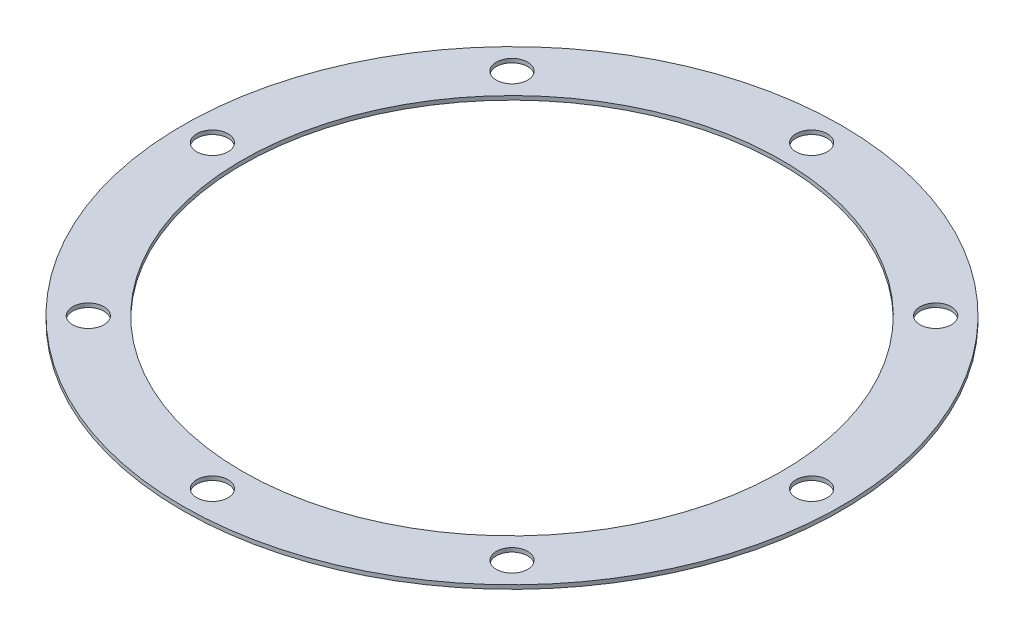
ISO-10303-21;
HEADER;
FILE_DESCRIPTION(('STEP AP214'),'2;1');
FILE_NAME('part.step','',(''),(''),'','','');
FILE_SCHEMA(('AUTOMOTIVE_DESIGN { 1 0 10303 214 1 1 1 1 }'));
ENDSEC;
DATA;
#1=APPLICATION_CONTEXT('core data for automotive mechanical design processes');
#2=APPLICATION_PROTOCOL_DEFINITION('international standard','automotive_design',2000,#1);
#3=PRODUCT_CONTEXT('',#1,'mechanical');
#4=PRODUCT('Part','Part','',(#3));
#5=PRODUCT_RELATED_PRODUCT_CATEGORY('part','',(#4));
#6=PRODUCT_DEFINITION_FORMATION('','',#4);
#7=PRODUCT_DEFINITION_CONTEXT('part definition',#1,'design');
#8=PRODUCT_DEFINITION('design','',#6,#7);
#9=PRODUCT_DEFINITION_SHAPE('','',#8);
#10=(LENGTH_UNIT() NAMED_UNIT(*) SI_UNIT(.MILLI.,.METRE.));
#11=(NAMED_UNIT(*) PLANE_ANGLE_UNIT() SI_UNIT($,.RADIAN.));
#12=(NAMED_UNIT(*) SI_UNIT($,.STERADIAN.) SOLID_ANGLE_UNIT());
#13=UNCERTAINTY_MEASURE_WITH_UNIT(LENGTH_MEASURE(1.E-05),#10,'distance_accuracy_value','');
#14=(GEOMETRIC_REPRESENTATION_CONTEXT(3) GLOBAL_UNCERTAINTY_ASSIGNED_CONTEXT((#13)) GLOBAL_UNIT_ASSIGNED_CONTEXT((#10,
#11,#12)) REPRESENTATION_CONTEXT('',''));
#15=CARTESIAN_POINT('',(0.,0.,0.));
#16=DIRECTION('',(0.,0.,1.));
#17=DIRECTION('',(1.,0.,0.));
#18=AXIS2_PLACEMENT_3D('',#15,#16,#17);
#19=CARTESIAN_POINT('',(0.,0.8382,0.));
#20=DIRECTION('',(0.,1.,0.));
#21=DIRECTION('',(0.,0.,1.));
#22=AXIS2_PLACEMENT_3D('',#19,#20,#21);
#23=PLANE('',#22);
#24=CARTESIAN_POINT('',(-63.5,0.8382,2.21709065016539E-13));
#25=DIRECTION('',(0.,1.,0.));
#26=DIRECTION('',(1.,0.,0.));
#27=AXIS2_PLACEMENT_3D('',#24,#25,#26);
#28=CIRCLE('',#27,3.3147);
#29=CARTESIAN_POINT('',(-60.1853,0.8382,2.10135851822676E-13));
#30=VERTEX_POINT('',#29);
#31=EDGE_CURVE('E133',#30,#30,#28,.T.);
#32=ORIENTED_EDGE('',*,*,#31,.F.);
#33=EDGE_LOOP('',(#32));
#34=FACE_BOUND('',#33,.T.);
#35=CARTESIAN_POINT('',(-44.9012806053455,0.8382,44.901280605346));
#36=DIRECTION('',(0.,1.,0.));
#37=DIRECTION('',(0.707106781186544,0.,-0.707106781186551));
#38=AXIS2_PLACEMENT_3D('',#35,#36,#37);
#39=CIRCLE('',#38,3.3147);
#40=CARTESIAN_POINT('',(-42.5574337577465,0.8382,42.5574337577469));
#41=VERTEX_POINT('',#40);
#42=EDGE_CURVE('E137',#41,#41,#39,.T.);
#43=ORIENTED_EDGE('',*,*,#42,.F.);
#44=EDGE_LOOP('',(#43));
#45=FACE_BOUND('',#44,.T.);
#46=CARTESIAN_POINT('',(0.,0.8382,63.5));
#47=DIRECTION('',(0.,1.,0.));
#48=DIRECTION('',(0.,0.,-1.));
#49=AXIS2_PLACEMENT_3D('',#46,#47,#48);
#50=CIRCLE('',#49,3.3147);
#51=CARTESIAN_POINT('',(0.,0.8382,60.1853));
#52=VERTEX_POINT('',#51);
#53=EDGE_CURVE('E141',#52,#52,#50,.T.);
#54=ORIENTED_EDGE('',*,*,#53,.F.);
#55=EDGE_LOOP('',(#54));
#56=FACE_BOUND('',#55,.T.);
#57=CARTESIAN_POINT('',(44.9012806053462,0.8382,44.9012806053454));
#58=DIRECTION('',(0.,1.,0.));
#59=DIRECTION('',(-0.707106781186554,0.,-0.707106781186541));
#60=AXIS2_PLACEMENT_3D('',#57,#58,#59);
#61=CIRCLE('',#60,3.3147);
#62=CARTESIAN_POINT('',(42.5574337577471,0.8382,42.5574337577464));
#63=VERTEX_POINT('',#62);
#64=EDGE_CURVE('E145',#63,#63,#61,.T.);
#65=ORIENTED_EDGE('',*,*,#64,.F.);
#66=EDGE_LOOP('',(#65));
#67=FACE_BOUND('',#66,.T.);
#68=CARTESIAN_POINT('',(63.5,0.8382,-6.65127195049617E-13));
#69=DIRECTION('',(0.,1.,0.));
#70=DIRECTION('',(-1.,0.,0.));
#71=AXIS2_PLACEMENT_3D('',#68,#69,#70);
#72=CIRCLE('',#71,3.3147);
#73=CARTESIAN_POINT('',(60.1853,0.8382,-6.30407555468027E-13));
#74=VERTEX_POINT('',#73);
#75=EDGE_CURVE('E149',#74,#74,#72,.T.);
#76=ORIENTED_EDGE('',*,*,#75,.F.);
#77=EDGE_LOOP('',(#76));
#78=FACE_BOUND('',#77,.T.);
#79=CARTESIAN_POINT('',(44.9012806053452,0.8382,-44.9012806053463));
#80=DIRECTION('',(0.,1.,0.));
#81=DIRECTION('',(-0.707106781186539,0.,0.707106781186556));
#82=AXIS2_PLACEMENT_3D('',#79,#80,#81);
#83=CIRCLE('',#82,3.3147);
#84=CARTESIAN_POINT('',(42.5574337577462,0.8382,-42.5574337577472));
#85=VERTEX_POINT('',#84);
#86=EDGE_CURVE('E153',#85,#85,#83,.T.);
#87=ORIENTED_EDGE('',*,*,#86,.F.);
#88=EDGE_LOOP('',(#87));
#89=FACE_BOUND('',#88,.T.);
#90=CARTESIAN_POINT('',(-44.9012806053459,0.8382,-44.9012806053457));
#91=DIRECTION('',(0.,1.,0.));
#92=DIRECTION('',(0.707106781186549,0.,0.707106781186546));
#93=AXIS2_PLACEMENT_3D('',#90,#91,#92);
#94=CIRCLE('',#93,3.3147);
#95=CARTESIAN_POINT('',(-42.5574337577468,0.8382,-42.5574337577467));
#96=VERTEX_POINT('',#95);
#97=EDGE_CURVE('E71',#96,#96,#94,.T.);
#98=ORIENTED_EDGE('',*,*,#97,.F.);
#99=EDGE_LOOP('',(#98));
#100=FACE_BOUND('',#99,.T.);
#101=CARTESIAN_POINT('',(0.,0.8382,-63.5));
#102=DIRECTION('',(0.,1.,0.));
#103=DIRECTION('',(0.,0.,1.));
#104=AXIS2_PLACEMENT_3D('',#101,#102,#103);
#105=CIRCLE('',#104,3.3147);
#106=CARTESIAN_POINT('',(0.,0.8382,-60.1853));
#107=VERTEX_POINT('',#106);
#108=EDGE_CURVE('E65',#107,#107,#105,.T.);
#109=ORIENTED_EDGE('',*,*,#108,.F.);
#110=EDGE_LOOP('',(#109));
#111=FACE_BOUND('',#110,.T.);
#112=CARTESIAN_POINT('',(0.,0.8382,0.));
#113=DIRECTION('',(0.,1.,0.));
#114=DIRECTION('',(0.,0.,1.));
#115=AXIS2_PLACEMENT_3D('',#112,#113,#114);
#116=CIRCLE('',#115,69.85);
#117=CARTESIAN_POINT('',(0.,0.8382,69.85));
#118=VERTEX_POINT('',#117);
#119=EDGE_CURVE('E10',#118,#118,#116,.T.);
#120=ORIENTED_EDGE('',*,*,#119,.T.);
#121=EDGE_LOOP('',(#120));
#122=FACE_BOUND('',#121,.T.);
#123=CARTESIAN_POINT('',(0.,0.8382,0.));
#124=DIRECTION('',(0.,1.,0.));
#125=DIRECTION('',(0.,0.,1.));
#126=AXIS2_PLACEMENT_3D('',#123,#124,#125);
#127=CIRCLE('',#126,57.15);
#128=CARTESIAN_POINT('',(0.,0.8382,57.15));
#129=VERTEX_POINT('',#128);
#130=EDGE_CURVE('E55',#129,#129,#127,.T.);
#131=ORIENTED_EDGE('',*,*,#130,.F.);
#132=EDGE_LOOP('',(#131));
#133=FACE_BOUND('',#132,.T.);
#134=ADVANCED_FACE('F40',(#34,#45,#56,#67,#78,#89,#100,#111,#122,#133),#23,.T.);
#135=CARTESIAN_POINT('',(0.,0.,0.));
#136=DIRECTION('',(0.,1.,0.));
#137=DIRECTION('',(0.,0.,1.));
#138=AXIS2_PLACEMENT_3D('',#135,#136,#137);
#139=PLANE('',#138);
#140=CARTESIAN_POINT('',(-63.5,0.,2.21709065016539E-13));
#141=DIRECTION('',(0.,1.,0.));
#142=DIRECTION('',(0.,0.,1.));
#143=AXIS2_PLACEMENT_3D('',#140,#141,#142);
#144=CIRCLE('',#143,3.3147);
#145=CARTESIAN_POINT('',(-63.5,0.,3.31470000000022));
#146=VERTEX_POINT('',#145);
#147=EDGE_CURVE('E44',#146,#146,#144,.T.);
#148=ORIENTED_EDGE('',*,*,#147,.T.);
#149=EDGE_LOOP('',(#148));
#150=FACE_BOUND('',#149,.T.);
#151=CARTESIAN_POINT('',(-44.9012806053455,0.,44.901280605346));
#152=DIRECTION('',(0.,1.,0.));
#153=DIRECTION('',(0.,0.,1.));
#154=AXIS2_PLACEMENT_3D('',#151,#152,#153);
#155=CIRCLE('',#154,3.3147);
#156=CARTESIAN_POINT('',(-44.9012806053455,0.,48.215980605346));
#157=VERTEX_POINT('',#156);
#158=EDGE_CURVE('E86',#157,#157,#155,.T.);
#159=ORIENTED_EDGE('',*,*,#158,.T.);
#160=EDGE_LOOP('',(#159));
#161=FACE_BOUND('',#160,.T.);
#162=CARTESIAN_POINT('',(0.,0.,63.5));
#163=DIRECTION('',(0.,1.,0.));
#164=DIRECTION('',(0.,0.,1.));
#165=AXIS2_PLACEMENT_3D('',#162,#163,#164);
#166=CIRCLE('',#165,3.3147);
#167=CARTESIAN_POINT('',(0.,0.,66.8147));
#168=VERTEX_POINT('',#167);
#169=EDGE_CURVE('E83',#168,#168,#166,.T.);
#170=ORIENTED_EDGE('',*,*,#169,.T.);
#171=EDGE_LOOP('',(#170));
#172=FACE_BOUND('',#171,.T.);
#173=CARTESIAN_POINT('',(44.9012806053462,0.,44.9012806053454));
#174=DIRECTION('',(0.,1.,0.));
#175=DIRECTION('',(0.,0.,1.));
#176=AXIS2_PLACEMENT_3D('',#173,#174,#175);
#177=CIRCLE('',#176,3.3147);
#178=CARTESIAN_POINT('',(44.9012806053462,0.,48.2159806053454));
#179=VERTEX_POINT('',#178);
#180=EDGE_CURVE('E79',#179,#179,#177,.T.);
#181=ORIENTED_EDGE('',*,*,#180,.T.);
#182=EDGE_LOOP('',(#181));
#183=FACE_BOUND('',#182,.T.);
#184=CARTESIAN_POINT('',(63.5,0.,-6.65127195049617E-13));
#185=DIRECTION('',(0.,1.,0.));
#186=DIRECTION('',(0.,0.,1.));
#187=AXIS2_PLACEMENT_3D('',#184,#185,#186);
#188=CIRCLE('',#187,3.3147);
#189=CARTESIAN_POINT('',(63.5,0.,3.31469999999933));
#190=VERTEX_POINT('',#189);
#191=EDGE_CURVE('E75',#190,#190,#188,.T.);
#192=ORIENTED_EDGE('',*,*,#191,.T.);
#193=EDGE_LOOP('',(#192));
#194=FACE_BOUND('',#193,.T.);
#195=CARTESIAN_POINT('',(44.9012806053452,0.,-44.9012806053463));
#196=DIRECTION('',(0.,1.,0.));
#197=DIRECTION('',(0.,0.,1.));
#198=AXIS2_PLACEMENT_3D('',#195,#196,#197);
#199=CIRCLE('',#198,3.3147);
#200=CARTESIAN_POINT('',(44.9012806053452,0.,-41.5865806053463));
#201=VERTEX_POINT('',#200);
#202=EDGE_CURVE('E70',#201,#201,#199,.T.);
#203=ORIENTED_EDGE('',*,*,#202,.T.);
#204=EDGE_LOOP('',(#203));
#205=FACE_BOUND('',#204,.T.);
#206=CARTESIAN_POINT('',(-44.9012806053459,0.,-44.9012806053457));
#207=DIRECTION('',(0.,1.,0.));
#208=DIRECTION('',(0.,0.,1.));
#209=AXIS2_PLACEMENT_3D('',#206,#207,#208);
#210=CIRCLE('',#209,3.3147);
#211=CARTESIAN_POINT('',(-44.9012806053459,0.,-41.5865806053457));
#212=VERTEX_POINT('',#211);
#213=EDGE_CURVE('E66',#212,#212,#210,.T.);
#214=ORIENTED_EDGE('',*,*,#213,.T.);
#215=EDGE_LOOP('',(#214));
#216=FACE_BOUND('',#215,.T.);
#217=CARTESIAN_POINT('',(0.,0.,-63.5));
#218=DIRECTION('',(0.,1.,0.));
#219=DIRECTION('',(0.,0.,1.));
#220=AXIS2_PLACEMENT_3D('',#217,#218,#219);
#221=CIRCLE('',#220,3.3147);
#222=CARTESIAN_POINT('',(0.,0.,-60.1853));
#223=VERTEX_POINT('',#222);
#224=EDGE_CURVE('E61',#223,#223,#221,.T.);
#225=ORIENTED_EDGE('',*,*,#224,.T.);
#226=EDGE_LOOP('',(#225));
#227=FACE_BOUND('',#226,.T.);
#228=CARTESIAN_POINT('',(0.,0.,0.));
#229=DIRECTION('',(0.,1.,0.));
#230=DIRECTION('',(0.,0.,1.));
#231=AXIS2_PLACEMENT_3D('',#228,#229,#230);
#232=CIRCLE('',#231,69.85);
#233=CARTESIAN_POINT('',(0.,0.,69.85));
#234=VERTEX_POINT('',#233);
#235=EDGE_CURVE('E49',#234,#234,#232,.T.);
#236=ORIENTED_EDGE('',*,*,#235,.F.);
#237=EDGE_LOOP('',(#236));
#238=FACE_BOUND('',#237,.T.);
#239=CARTESIAN_POINT('',(0.,0.,0.));
#240=DIRECTION('',(0.,1.,0.));
#241=DIRECTION('',(0.,0.,1.));
#242=AXIS2_PLACEMENT_3D('',#239,#240,#241);
#243=CIRCLE('',#242,57.15);
#244=CARTESIAN_POINT('',(0.,0.,57.15));
#245=VERTEX_POINT('',#244);
#246=EDGE_CURVE('E58',#245,#245,#243,.T.);
#247=ORIENTED_EDGE('',*,*,#246,.T.);
#248=EDGE_LOOP('',(#247));
#249=FACE_BOUND('',#248,.T.);
#250=ADVANCED_FACE('F110',(#150,#161,#172,#183,#194,#205,#216,#227,#238,#249),#139,.F.);
#251=CARTESIAN_POINT('',(0.,0.8382,0.));
#252=DIRECTION('',(0.,-1.,0.));
#253=DIRECTION('',(0.,0.,-1.));
#254=AXIS2_PLACEMENT_3D('',#251,#252,#253);
#255=CYLINDRICAL_SURFACE('',#254,69.85);
#256=ORIENTED_EDGE('',*,*,#119,.F.);
#257=EDGE_LOOP('',(#256));
#258=FACE_BOUND('',#257,.T.);
#259=ORIENTED_EDGE('',*,*,#235,.T.);
#260=EDGE_LOOP('',(#259));
#261=FACE_BOUND('',#260,.T.);
#262=ADVANCED_FACE('F42',(#258,#261),#255,.T.);
#263=CARTESIAN_POINT('',(0.,0.8382,0.));
#264=DIRECTION('',(0.,-1.,0.));
#265=DIRECTION('',(0.,0.,-1.));
#266=AXIS2_PLACEMENT_3D('',#263,#264,#265);
#267=CYLINDRICAL_SURFACE('',#266,57.15);
#268=ORIENTED_EDGE('',*,*,#130,.T.);
#269=EDGE_LOOP('',(#268));
#270=FACE_BOUND('',#269,.T.);
#271=ORIENTED_EDGE('',*,*,#246,.F.);
#272=EDGE_LOOP('',(#271));
#273=FACE_BOUND('',#272,.T.);
#274=ADVANCED_FACE('F112',(#270,#273),#267,.F.);
#275=CARTESIAN_POINT('',(0.,-1.7018,-63.5));
#276=DIRECTION('',(0.,1.,0.));
#277=DIRECTION('',(0.,0.,1.));
#278=AXIS2_PLACEMENT_3D('',#275,#276,#277);
#279=CYLINDRICAL_SURFACE('',#278,3.3147);
#280=ORIENTED_EDGE('',*,*,#108,.T.);
#281=EDGE_LOOP('',(#280));
#282=FACE_BOUND('',#281,.T.);
#283=ORIENTED_EDGE('',*,*,#224,.F.);
#284=EDGE_LOOP('',(#283));
#285=FACE_BOUND('',#284,.T.);
#286=ADVANCED_FACE('F114',(#282,#285),#279,.F.);
#287=CARTESIAN_POINT('',(-44.9012806053459,-1.7018,-44.9012806053457));
#288=DIRECTION('',(0.,1.,0.));
#289=DIRECTION('',(0.,0.,1.));
#290=AXIS2_PLACEMENT_3D('',#287,#288,#289);
#291=CYLINDRICAL_SURFACE('',#290,3.3147);
#292=ORIENTED_EDGE('',*,*,#97,.T.);
#293=EDGE_LOOP('',(#292));
#294=FACE_BOUND('',#293,.T.);
#295=ORIENTED_EDGE('',*,*,#213,.F.);
#296=EDGE_LOOP('',(#295));
#297=FACE_BOUND('',#296,.T.);
#298=ADVANCED_FACE('F120',(#294,#297),#291,.F.);
#299=CARTESIAN_POINT('',(44.9012806053452,-1.7018,-44.9012806053463));
#300=DIRECTION('',(0.,1.,0.));
#301=DIRECTION('',(0.,0.,1.));
#302=AXIS2_PLACEMENT_3D('',#299,#300,#301);
#303=CYLINDRICAL_SURFACE('',#302,3.3147);
#304=ORIENTED_EDGE('',*,*,#86,.T.);
#305=EDGE_LOOP('',(#304));
#306=FACE_BOUND('',#305,.T.);
#307=ORIENTED_EDGE('',*,*,#202,.F.);
#308=EDGE_LOOP('',(#307));
#309=FACE_BOUND('',#308,.T.);
#310=ADVANCED_FACE('F175',(#306,#309),#303,.F.);
#311=CARTESIAN_POINT('',(63.5,-1.7018,-6.65127195049617E-13));
#312=DIRECTION('',(0.,1.,0.));
#313=DIRECTION('',(0.,0.,1.));
#314=AXIS2_PLACEMENT_3D('',#311,#312,#313);
#315=CYLINDRICAL_SURFACE('',#314,3.3147);
#316=ORIENTED_EDGE('',*,*,#75,.T.);
#317=EDGE_LOOP('',(#316));
#318=FACE_BOUND('',#317,.T.);
#319=ORIENTED_EDGE('',*,*,#191,.F.);
#320=EDGE_LOOP('',(#319));
#321=FACE_BOUND('',#320,.T.);
#322=ADVANCED_FACE('F178',(#318,#321),#315,.F.);
#323=CARTESIAN_POINT('',(44.9012806053462,-1.7018,44.9012806053454));
#324=DIRECTION('',(0.,1.,0.));
#325=DIRECTION('',(0.,0.,1.));
#326=AXIS2_PLACEMENT_3D('',#323,#324,#325);
#327=CYLINDRICAL_SURFACE('',#326,3.3147);
#328=ORIENTED_EDGE('',*,*,#64,.T.);
#329=EDGE_LOOP('',(#328));
#330=FACE_BOUND('',#329,.T.);
#331=ORIENTED_EDGE('',*,*,#180,.F.);
#332=EDGE_LOOP('',(#331));
#333=FACE_BOUND('',#332,.T.);
#334=ADVANCED_FACE('F196',(#330,#333),#327,.F.);
#335=CARTESIAN_POINT('',(0.,-1.7018,63.5));
#336=DIRECTION('',(0.,1.,0.));
#337=DIRECTION('',(0.,0.,1.));
#338=AXIS2_PLACEMENT_3D('',#335,#336,#337);
#339=CYLINDRICAL_SURFACE('',#338,3.3147);
#340=ORIENTED_EDGE('',*,*,#53,.T.);
#341=EDGE_LOOP('',(#340));
#342=FACE_BOUND('',#341,.T.);
#343=ORIENTED_EDGE('',*,*,#169,.F.);
#344=EDGE_LOOP('',(#343));
#345=FACE_BOUND('',#344,.T.);
#346=ADVANCED_FACE('F199',(#342,#345),#339,.F.);
#347=CARTESIAN_POINT('',(-44.9012806053455,-1.7018,44.901280605346));
#348=DIRECTION('',(0.,1.,0.));
#349=DIRECTION('',(0.,0.,1.));
#350=AXIS2_PLACEMENT_3D('',#347,#348,#349);
#351=CYLINDRICAL_SURFACE('',#350,3.3147);
#352=ORIENTED_EDGE('',*,*,#42,.T.);
#353=EDGE_LOOP('',(#352));
#354=FACE_BOUND('',#353,.T.);
#355=ORIENTED_EDGE('',*,*,#158,.F.);
#356=EDGE_LOOP('',(#355));
#357=FACE_BOUND('',#356,.T.);
#358=ADVANCED_FACE('F202',(#354,#357),#351,.F.);
#359=CARTESIAN_POINT('',(-63.5,-1.7018,2.21709065016539E-13));
#360=DIRECTION('',(0.,1.,0.));
#361=DIRECTION('',(0.,0.,1.));
#362=AXIS2_PLACEMENT_3D('',#359,#360,#361);
#363=CYLINDRICAL_SURFACE('',#362,3.3147);
#364=ORIENTED_EDGE('',*,*,#31,.T.);
#365=EDGE_LOOP('',(#364));
#366=FACE_BOUND('',#365,.T.);
#367=ORIENTED_EDGE('',*,*,#147,.F.);
#368=EDGE_LOOP('',(#367));
#369=FACE_BOUND('',#368,.T.);
#370=ADVANCED_FACE('F206',(#366,#369),#363,.F.);
#371=CLOSED_SHELL('',(#134,#250,#262,#274,#286,#298,#310,#322,#334,#346,#358,#370));
#372=MANIFOLD_SOLID_BREP('B2',#371);
#373=ADVANCED_BREP_SHAPE_REPRESENTATION('',(#18,#372),#14);
#374=SHAPE_DEFINITION_REPRESENTATION(#9,#373);
ENDSEC;
END-ISO-10303-21;
